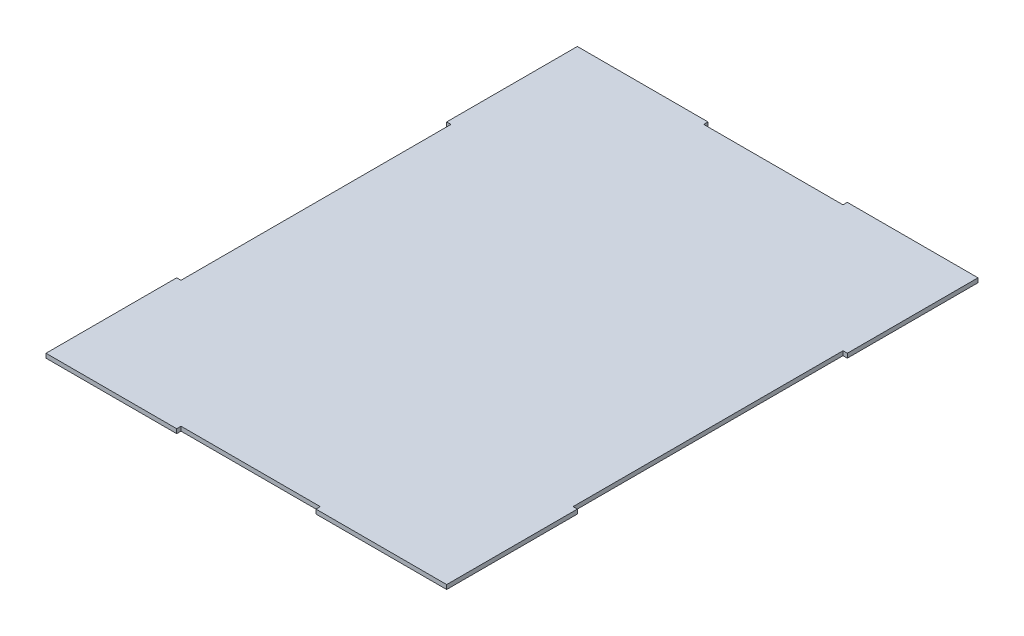
ISO-10303-21;
HEADER;
FILE_DESCRIPTION(('STEP AP214'),'2;1');
FILE_NAME('part.step','',(''),(''),'','','');
FILE_SCHEMA(('AUTOMOTIVE_DESIGN { 1 0 10303 214 1 1 1 1 }'));
ENDSEC;
DATA;
#1=APPLICATION_CONTEXT('core data for automotive mechanical design processes');
#2=APPLICATION_PROTOCOL_DEFINITION('international standard','automotive_design',2000,#1);
#3=PRODUCT_CONTEXT('',#1,'mechanical');
#4=PRODUCT('Part','Part','',(#3));
#5=PRODUCT_RELATED_PRODUCT_CATEGORY('part','',(#4));
#6=PRODUCT_DEFINITION_FORMATION('','',#4);
#7=PRODUCT_DEFINITION_CONTEXT('part definition',#1,'design');
#8=PRODUCT_DEFINITION('design','',#6,#7);
#9=PRODUCT_DEFINITION_SHAPE('','',#8);
#10=(LENGTH_UNIT() NAMED_UNIT(*) SI_UNIT(.MILLI.,.METRE.));
#11=(NAMED_UNIT(*) PLANE_ANGLE_UNIT() SI_UNIT($,.RADIAN.));
#12=(NAMED_UNIT(*) SI_UNIT($,.STERADIAN.) SOLID_ANGLE_UNIT());
#13=UNCERTAINTY_MEASURE_WITH_UNIT(LENGTH_MEASURE(1.E-05),#10,'distance_accuracy_value','');
#14=(GEOMETRIC_REPRESENTATION_CONTEXT(3) GLOBAL_UNCERTAINTY_ASSIGNED_CONTEXT((#13)) GLOBAL_UNIT_ASSIGNED_CONTEXT((#10,
#11,#12)) REPRESENTATION_CONTEXT('',''));
#15=CARTESIAN_POINT('',(0.,0.,0.));
#16=DIRECTION('',(0.,0.,1.));
#17=DIRECTION('',(1.,0.,0.));
#18=AXIS2_PLACEMENT_3D('',#15,#16,#17);
#19=CARTESIAN_POINT('',(0.,3.3,200.));
#20=DIRECTION('',(0.,0.,-1.));
#21=DIRECTION('',(-1.,0.,0.));
#22=AXIS2_PLACEMENT_3D('',#19,#20,#21);
#23=PLANE('',#22);
#24=DIRECTION('',(1.,0.,0.));
#25=VECTOR('',#24,1.);
#26=CARTESIAN_POINT('',(0.,0.,200.));
#27=LINE('',#26,#25);
#28=CARTESIAN_POINT('',(-53.3000000000001,0.,200.));
#29=VERTEX_POINT('',#28);
#30=CARTESIAN_POINT('',(53.3000000000001,0.,200.));
#31=VERTEX_POINT('',#30);
#32=EDGE_CURVE('E217',#29,#31,#27,.T.);
#33=ORIENTED_EDGE('',*,*,#32,.T.);
#34=DIRECTION('',(0.,-1.,0.));
#35=VECTOR('',#34,1.);
#36=CARTESIAN_POINT('',(53.3000000000001,3.3,200.));
#37=LINE('',#36,#35);
#38=CARTESIAN_POINT('',(53.3000000000001,3.3,200.));
#39=VERTEX_POINT('',#38);
#40=EDGE_CURVE('E11',#39,#31,#37,.T.);
#41=ORIENTED_EDGE('',*,*,#40,.F.);
#42=DIRECTION('',(1.,0.,0.));
#43=VECTOR('',#42,1.);
#44=CARTESIAN_POINT('',(0.,3.3,200.));
#45=LINE('',#44,#43);
#46=CARTESIAN_POINT('',(-53.3000000000001,3.3,200.));
#47=VERTEX_POINT('',#46);
#48=EDGE_CURVE('E288',#47,#39,#45,.T.);
#49=ORIENTED_EDGE('',*,*,#48,.F.);
#50=DIRECTION('',(0.,-1.,0.));
#51=VECTOR('',#50,1.);
#52=CARTESIAN_POINT('',(-53.3000000000001,3.3,200.));
#53=LINE('',#52,#51);
#54=EDGE_CURVE('E58',#47,#29,#53,.T.);
#55=ORIENTED_EDGE('',*,*,#54,.T.);
#56=EDGE_LOOP('',(#33,#41,#49,#55));
#57=FACE_BOUND('',#56,.T.);
#58=ADVANCED_FACE('F41',(#57),#23,.F.);
#59=CARTESIAN_POINT('',(53.3000000000114,3.3,3.0259885506409E-12));
#60=DIRECTION('',(1.,0.,0.));
#61=DIRECTION('',(0.,0.,-1.));
#62=AXIS2_PLACEMENT_3D('',#59,#60,#61);
#63=PLANE('',#62);
#64=DIRECTION('',(0.,0.,1.));
#65=VECTOR('',#64,1.);
#66=CARTESIAN_POINT('',(53.3000000000114,0.,3.0259885506409E-12));
#67=LINE('',#66,#65);
#68=CARTESIAN_POINT('',(53.2999999999999,0.,203.3));
#69=VERTEX_POINT('',#68);
#70=EDGE_CURVE('E220',#31,#69,#67,.T.);
#71=ORIENTED_EDGE('',*,*,#70,.T.);
#72=DIRECTION('',(0.,-1.,0.));
#73=VECTOR('',#72,1.);
#74=CARTESIAN_POINT('',(53.2999999999999,3.3,203.3));
#75=LINE('',#74,#73);
#76=CARTESIAN_POINT('',(53.2999999999999,3.3,203.3));
#77=VERTEX_POINT('',#76);
#78=EDGE_CURVE('E50',#77,#69,#75,.T.);
#79=ORIENTED_EDGE('',*,*,#78,.F.);
#80=DIRECTION('',(0.,0.,1.));
#81=VECTOR('',#80,1.);
#82=CARTESIAN_POINT('',(53.3000000000114,3.3,3.0259885506409E-12));
#83=LINE('',#82,#81);
#84=EDGE_CURVE('E133',#39,#77,#83,.T.);
#85=ORIENTED_EDGE('',*,*,#84,.F.);
#86=ORIENTED_EDGE('',*,*,#40,.T.);
#87=EDGE_LOOP('',(#71,#79,#85,#86));
#88=FACE_BOUND('',#87,.T.);
#89=ADVANCED_FACE('F348',(#88),#63,.F.);
#90=CARTESIAN_POINT('',(0.,3.3,203.3));
#91=DIRECTION('',(0.,0.,1.));
#92=DIRECTION('',(1.,0.,0.));
#93=AXIS2_PLACEMENT_3D('',#90,#91,#92);
#94=PLANE('',#93);
#95=DIRECTION('',(-1.,0.,0.));
#96=VECTOR('',#95,1.);
#97=CARTESIAN_POINT('',(0.,0.,203.3));
#98=LINE('',#97,#96);
#99=CARTESIAN_POINT('',(153.3,0.,203.3));
#100=VERTEX_POINT('',#99);
#101=EDGE_CURVE('E224',#100,#69,#98,.T.);
#102=ORIENTED_EDGE('',*,*,#101,.F.);
#103=DIRECTION('',(0.,-1.,0.));
#104=VECTOR('',#103,1.);
#105=CARTESIAN_POINT('',(153.3,3.3,203.3));
#106=LINE('',#105,#104);
#107=CARTESIAN_POINT('',(153.3,3.3,203.3));
#108=VERTEX_POINT('',#107);
#109=EDGE_CURVE('E339',#108,#100,#106,.T.);
#110=ORIENTED_EDGE('',*,*,#109,.F.);
#111=DIRECTION('',(-1.,0.,0.));
#112=VECTOR('',#111,1.);
#113=CARTESIAN_POINT('',(0.,3.3,203.3));
#114=LINE('',#113,#112);
#115=EDGE_CURVE('E347',#108,#77,#114,.T.);
#116=ORIENTED_EDGE('',*,*,#115,.T.);
#117=ORIENTED_EDGE('',*,*,#78,.T.);
#118=EDGE_LOOP('',(#102,#110,#116,#117));
#119=FACE_BOUND('',#118,.T.);
#120=ADVANCED_FACE('F345',(#119),#94,.T.);
#121=CARTESIAN_POINT('',(153.300000000002,3.3,1.28937264905332E-12));
#122=DIRECTION('',(1.,0.,0.));
#123=DIRECTION('',(0.,0.,-1.));
#124=AXIS2_PLACEMENT_3D('',#121,#122,#123);
#125=PLANE('',#124);
#126=DIRECTION('',(0.,0.,1.));
#127=VECTOR('',#126,1.);
#128=CARTESIAN_POINT('',(153.300000000002,0.,1.28937264905332E-12));
#129=LINE('',#128,#127);
#130=CARTESIAN_POINT('',(153.3,0.,103.3));
#131=VERTEX_POINT('',#130);
#132=EDGE_CURVE('E228',#131,#100,#129,.T.);
#133=ORIENTED_EDGE('',*,*,#132,.F.);
#134=DIRECTION('',(0.,-1.,0.));
#135=VECTOR('',#134,1.);
#136=CARTESIAN_POINT('',(153.3,3.3,103.3));
#137=LINE('',#136,#135);
#138=CARTESIAN_POINT('',(153.3,3.3,103.3));
#139=VERTEX_POINT('',#138);
#140=EDGE_CURVE('E336',#139,#131,#137,.T.);
#141=ORIENTED_EDGE('',*,*,#140,.F.);
#142=DIRECTION('',(0.,0.,1.));
#143=VECTOR('',#142,1.);
#144=CARTESIAN_POINT('',(153.300000000002,3.3,1.28937264905332E-12));
#145=LINE('',#144,#143);
#146=EDGE_CURVE('E360',#139,#108,#145,.T.);
#147=ORIENTED_EDGE('',*,*,#146,.T.);
#148=ORIENTED_EDGE('',*,*,#109,.T.);
#149=EDGE_LOOP('',(#133,#141,#147,#148));
#150=FACE_BOUND('',#149,.T.);
#151=ADVANCED_FACE('F356',(#150),#125,.T.);
#152=CARTESIAN_POINT('',(0.,3.3,103.3));
#153=DIRECTION('',(0.,0.,1.));
#154=DIRECTION('',(1.,0.,0.));
#155=AXIS2_PLACEMENT_3D('',#152,#153,#154);
#156=PLANE('',#155);
#157=DIRECTION('',(-1.,0.,0.));
#158=VECTOR('',#157,1.);
#159=CARTESIAN_POINT('',(0.,0.,103.3));
#160=LINE('',#159,#158);
#161=CARTESIAN_POINT('',(150.,0.,103.3));
#162=VERTEX_POINT('',#161);
#163=EDGE_CURVE('E232',#131,#162,#160,.T.);
#164=ORIENTED_EDGE('',*,*,#163,.T.);
#165=DIRECTION('',(0.,-1.,0.));
#166=VECTOR('',#165,1.);
#167=CARTESIAN_POINT('',(150.,3.3,103.3));
#168=LINE('',#167,#166);
#169=CARTESIAN_POINT('',(150.,3.3,103.3));
#170=VERTEX_POINT('',#169);
#171=EDGE_CURVE('E332',#170,#162,#168,.T.);
#172=ORIENTED_EDGE('',*,*,#171,.F.);
#173=DIRECTION('',(-1.,0.,0.));
#174=VECTOR('',#173,1.);
#175=CARTESIAN_POINT('',(0.,3.3,103.3));
#176=LINE('',#175,#174);
#177=EDGE_CURVE('E365',#139,#170,#176,.T.);
#178=ORIENTED_EDGE('',*,*,#177,.F.);
#179=ORIENTED_EDGE('',*,*,#140,.T.);
#180=EDGE_LOOP('',(#164,#172,#178,#179));
#181=FACE_BOUND('',#180,.T.);
#182=ADVANCED_FACE('F437',(#181),#156,.F.);
#183=CARTESIAN_POINT('',(150.,3.3,0.));
#184=DIRECTION('',(-1.,0.,0.));
#185=DIRECTION('',(0.,0.,1.));
#186=AXIS2_PLACEMENT_3D('',#183,#184,#185);
#187=PLANE('',#186);
#188=DIRECTION('',(0.,0.,-1.));
#189=VECTOR('',#188,1.);
#190=CARTESIAN_POINT('',(150.,0.,0.));
#191=LINE('',#190,#189);
#192=CARTESIAN_POINT('',(150.,0.,-103.3));
#193=VERTEX_POINT('',#192);
#194=EDGE_CURVE('E235',#162,#193,#191,.T.);
#195=ORIENTED_EDGE('',*,*,#194,.T.);
#196=DIRECTION('',(0.,-1.,0.));
#197=VECTOR('',#196,1.);
#198=CARTESIAN_POINT('',(150.,3.3,-103.3));
#199=LINE('',#198,#197);
#200=CARTESIAN_POINT('',(150.,3.3,-103.3));
#201=VERTEX_POINT('',#200);
#202=EDGE_CURVE('E328',#201,#193,#199,.T.);
#203=ORIENTED_EDGE('',*,*,#202,.F.);
#204=DIRECTION('',(0.,0.,-1.));
#205=VECTOR('',#204,1.);
#206=CARTESIAN_POINT('',(150.,3.3,0.));
#207=LINE('',#206,#205);
#208=EDGE_CURVE('E372',#170,#201,#207,.T.);
#209=ORIENTED_EDGE('',*,*,#208,.F.);
#210=ORIENTED_EDGE('',*,*,#171,.T.);
#211=EDGE_LOOP('',(#195,#203,#209,#210));
#212=FACE_BOUND('',#211,.T.);
#213=ADVANCED_FACE('F440',(#212),#187,.F.);
#214=CARTESIAN_POINT('',(0.,3.3,-103.3));
#215=DIRECTION('',(0.,0.,-1.));
#216=DIRECTION('',(-1.,0.,0.));
#217=AXIS2_PLACEMENT_3D('',#214,#215,#216);
#218=PLANE('',#217);
#219=DIRECTION('',(1.,0.,0.));
#220=VECTOR('',#219,1.);
#221=CARTESIAN_POINT('',(0.,0.,-103.3));
#222=LINE('',#221,#220);
#223=CARTESIAN_POINT('',(153.3,0.,-103.3));
#224=VERTEX_POINT('',#223);
#225=EDGE_CURVE('E238',#193,#224,#222,.T.);
#226=ORIENTED_EDGE('',*,*,#225,.T.);
#227=DIRECTION('',(0.,-1.,0.));
#228=VECTOR('',#227,1.);
#229=CARTESIAN_POINT('',(153.3,3.3,-103.3));
#230=LINE('',#229,#228);
#231=CARTESIAN_POINT('',(153.3,3.3,-103.3));
#232=VERTEX_POINT('',#231);
#233=EDGE_CURVE('E324',#232,#224,#230,.T.);
#234=ORIENTED_EDGE('',*,*,#233,.F.);
#235=DIRECTION('',(1.,0.,0.));
#236=VECTOR('',#235,1.);
#237=CARTESIAN_POINT('',(0.,3.3,-103.3));
#238=LINE('',#237,#236);
#239=EDGE_CURVE('E375',#201,#232,#238,.T.);
#240=ORIENTED_EDGE('',*,*,#239,.F.);
#241=ORIENTED_EDGE('',*,*,#202,.T.);
#242=EDGE_LOOP('',(#226,#234,#240,#241));
#243=FACE_BOUND('',#242,.T.);
#244=ADVANCED_FACE('F444',(#243),#218,.F.);
#245=CARTESIAN_POINT('',(153.3,3.3,0.));
#246=DIRECTION('',(-1.,0.,0.));
#247=DIRECTION('',(0.,0.,1.));
#248=AXIS2_PLACEMENT_3D('',#245,#246,#247);
#249=PLANE('',#248);
#250=DIRECTION('',(0.,0.,-1.));
#251=VECTOR('',#250,1.);
#252=CARTESIAN_POINT('',(153.3,0.,0.));
#253=LINE('',#252,#251);
#254=CARTESIAN_POINT('',(153.3,0.,-203.3));
#255=VERTEX_POINT('',#254);
#256=EDGE_CURVE('E241',#224,#255,#253,.T.);
#257=ORIENTED_EDGE('',*,*,#256,.T.);
#258=DIRECTION('',(0.,-1.,0.));
#259=VECTOR('',#258,1.);
#260=CARTESIAN_POINT('',(153.3,3.3,-203.3));
#261=LINE('',#260,#259);
#262=CARTESIAN_POINT('',(153.3,3.3,-203.3));
#263=VERTEX_POINT('',#262);
#264=EDGE_CURVE('E320',#263,#255,#261,.T.);
#265=ORIENTED_EDGE('',*,*,#264,.F.);
#266=DIRECTION('',(0.,0.,-1.));
#267=VECTOR('',#266,1.);
#268=CARTESIAN_POINT('',(153.3,3.3,0.));
#269=LINE('',#268,#267);
#270=EDGE_CURVE('E378',#232,#263,#269,.T.);
#271=ORIENTED_EDGE('',*,*,#270,.F.);
#272=ORIENTED_EDGE('',*,*,#233,.T.);
#273=EDGE_LOOP('',(#257,#265,#271,#272));
#274=FACE_BOUND('',#273,.T.);
#275=ADVANCED_FACE('F448',(#274),#249,.F.);
#276=CARTESIAN_POINT('',(0.,3.3,-203.3));
#277=DIRECTION('',(0.,0.,1.));
#278=DIRECTION('',(1.,0.,0.));
#279=AXIS2_PLACEMENT_3D('',#276,#277,#278);
#280=PLANE('',#279);
#281=DIRECTION('',(-1.,0.,0.));
#282=VECTOR('',#281,1.);
#283=CARTESIAN_POINT('',(0.,0.,-203.3));
#284=LINE('',#283,#282);
#285=CARTESIAN_POINT('',(53.2999999999999,0.,-203.3));
#286=VERTEX_POINT('',#285);
#287=EDGE_CURVE('E244',#255,#286,#284,.T.);
#288=ORIENTED_EDGE('',*,*,#287,.T.);
#289=DIRECTION('',(0.,-1.,0.));
#290=VECTOR('',#289,1.);
#291=CARTESIAN_POINT('',(53.2999999999999,3.3,-203.3));
#292=LINE('',#291,#290);
#293=CARTESIAN_POINT('',(53.2999999999999,3.3,-203.3));
#294=VERTEX_POINT('',#293);
#295=EDGE_CURVE('E317',#294,#286,#292,.T.);
#296=ORIENTED_EDGE('',*,*,#295,.F.);
#297=DIRECTION('',(-1.,0.,0.));
#298=VECTOR('',#297,1.);
#299=CARTESIAN_POINT('',(0.,3.3,-203.3));
#300=LINE('',#299,#298);
#301=EDGE_CURVE('E381',#263,#294,#300,.T.);
#302=ORIENTED_EDGE('',*,*,#301,.F.);
#303=ORIENTED_EDGE('',*,*,#264,.T.);
#304=EDGE_LOOP('',(#288,#296,#302,#303));
#305=FACE_BOUND('',#304,.T.);
#306=ADVANCED_FACE('F452',(#305),#280,.F.);
#307=CARTESIAN_POINT('',(53.2999999999999,3.3,0.));
#308=DIRECTION('',(-1.,0.,0.));
#309=DIRECTION('',(0.,0.,1.));
#310=AXIS2_PLACEMENT_3D('',#307,#308,#309);
#311=PLANE('',#310);
#312=DIRECTION('',(0.,0.,-1.));
#313=VECTOR('',#312,1.);
#314=CARTESIAN_POINT('',(53.2999999999999,0.,0.));
#315=LINE('',#314,#313);
#316=CARTESIAN_POINT('',(53.2999999999999,0.,-200.));
#317=VERTEX_POINT('',#316);
#318=EDGE_CURVE('E248',#317,#286,#315,.T.);
#319=ORIENTED_EDGE('',*,*,#318,.F.);
#320=DIRECTION('',(0.,-1.,0.));
#321=VECTOR('',#320,1.);
#322=CARTESIAN_POINT('',(53.2999999999999,3.3,-200.));
#323=LINE('',#322,#321);
#324=CARTESIAN_POINT('',(53.2999999999999,3.3,-200.));
#325=VERTEX_POINT('',#324);
#326=EDGE_CURVE('E314',#325,#317,#323,.T.);
#327=ORIENTED_EDGE('',*,*,#326,.F.);
#328=DIRECTION('',(0.,0.,-1.));
#329=VECTOR('',#328,1.);
#330=CARTESIAN_POINT('',(53.2999999999999,3.3,0.));
#331=LINE('',#330,#329);
#332=EDGE_CURVE('E384',#325,#294,#331,.T.);
#333=ORIENTED_EDGE('',*,*,#332,.T.);
#334=ORIENTED_EDGE('',*,*,#295,.T.);
#335=EDGE_LOOP('',(#319,#327,#333,#334));
#336=FACE_BOUND('',#335,.T.);
#337=ADVANCED_FACE('F456',(#336),#311,.T.);
#338=CARTESIAN_POINT('',(0.,3.3,-200.));
#339=DIRECTION('',(0.,0.,-1.));
#340=DIRECTION('',(-1.,0.,0.));
#341=AXIS2_PLACEMENT_3D('',#338,#339,#340);
#342=PLANE('',#341);
#343=DIRECTION('',(1.,0.,0.));
#344=VECTOR('',#343,1.);
#345=CARTESIAN_POINT('',(0.,0.,-200.));
#346=LINE('',#345,#344);
#347=CARTESIAN_POINT('',(-53.2999999999999,0.,-200.));
#348=VERTEX_POINT('',#347);
#349=EDGE_CURVE('E252',#348,#317,#346,.T.);
#350=ORIENTED_EDGE('',*,*,#349,.F.);
#351=DIRECTION('',(0.,-1.,0.));
#352=VECTOR('',#351,1.);
#353=CARTESIAN_POINT('',(-53.2999999999999,3.3,-200.));
#354=LINE('',#353,#352);
#355=CARTESIAN_POINT('',(-53.2999999999999,3.3,-200.));
#356=VERTEX_POINT('',#355);
#357=EDGE_CURVE('E311',#356,#348,#354,.T.);
#358=ORIENTED_EDGE('',*,*,#357,.F.);
#359=DIRECTION('',(1.,0.,0.));
#360=VECTOR('',#359,1.);
#361=CARTESIAN_POINT('',(0.,3.3,-200.));
#362=LINE('',#361,#360);
#363=EDGE_CURVE('E388',#356,#325,#362,.T.);
#364=ORIENTED_EDGE('',*,*,#363,.T.);
#365=ORIENTED_EDGE('',*,*,#326,.T.);
#366=EDGE_LOOP('',(#350,#358,#364,#365));
#367=FACE_BOUND('',#366,.T.);
#368=ADVANCED_FACE('F460',(#367),#342,.T.);
#369=CARTESIAN_POINT('',(-53.2999999999999,3.3,0.));
#370=DIRECTION('',(-1.,0.,0.));
#371=DIRECTION('',(0.,0.,1.));
#372=AXIS2_PLACEMENT_3D('',#369,#370,#371);
#373=PLANE('',#372);
#374=DIRECTION('',(0.,0.,-1.));
#375=VECTOR('',#374,1.);
#376=CARTESIAN_POINT('',(-53.2999999999999,0.,0.));
#377=LINE('',#376,#375);
#378=CARTESIAN_POINT('',(-53.2999999999999,0.,-203.3));
#379=VERTEX_POINT('',#378);
#380=EDGE_CURVE('E256',#348,#379,#377,.T.);
#381=ORIENTED_EDGE('',*,*,#380,.T.);
#382=DIRECTION('',(0.,-1.,0.));
#383=VECTOR('',#382,1.);
#384=CARTESIAN_POINT('',(-53.2999999999999,3.3,-203.3));
#385=LINE('',#384,#383);
#386=CARTESIAN_POINT('',(-53.2999999999999,3.3,-203.3));
#387=VERTEX_POINT('',#386);
#388=EDGE_CURVE('E308',#387,#379,#385,.T.);
#389=ORIENTED_EDGE('',*,*,#388,.F.);
#390=DIRECTION('',(0.,0.,-1.));
#391=VECTOR('',#390,1.);
#392=CARTESIAN_POINT('',(-53.2999999999999,3.3,0.));
#393=LINE('',#392,#391);
#394=EDGE_CURVE('E392',#356,#387,#393,.T.);
#395=ORIENTED_EDGE('',*,*,#394,.F.);
#396=ORIENTED_EDGE('',*,*,#357,.T.);
#397=EDGE_LOOP('',(#381,#389,#395,#396));
#398=FACE_BOUND('',#397,.T.);
#399=ADVANCED_FACE('F464',(#398),#373,.F.);
#400=CARTESIAN_POINT('',(0.,3.3,-203.3));
#401=DIRECTION('',(0.,0.,-1.));
#402=DIRECTION('',(-1.,0.,0.));
#403=AXIS2_PLACEMENT_3D('',#400,#401,#402);
#404=PLANE('',#403);
#405=DIRECTION('',(1.,0.,0.));
#406=VECTOR('',#405,1.);
#407=CARTESIAN_POINT('',(0.,0.,-203.3));
#408=LINE('',#407,#406);
#409=CARTESIAN_POINT('',(-153.3,0.,-203.3));
#410=VERTEX_POINT('',#409);
#411=EDGE_CURVE('E260',#410,#379,#408,.T.);
#412=ORIENTED_EDGE('',*,*,#411,.F.);
#413=DIRECTION('',(0.,-1.,0.));
#414=VECTOR('',#413,1.);
#415=CARTESIAN_POINT('',(-153.3,3.3,-203.3));
#416=LINE('',#415,#414);
#417=CARTESIAN_POINT('',(-153.3,3.3,-203.3));
#418=VERTEX_POINT('',#417);
#419=EDGE_CURVE('E305',#418,#410,#416,.T.);
#420=ORIENTED_EDGE('',*,*,#419,.F.);
#421=DIRECTION('',(1.,0.,0.));
#422=VECTOR('',#421,1.);
#423=CARTESIAN_POINT('',(0.,3.3,-203.3));
#424=LINE('',#423,#422);
#425=EDGE_CURVE('E395',#418,#387,#424,.T.);
#426=ORIENTED_EDGE('',*,*,#425,.T.);
#427=ORIENTED_EDGE('',*,*,#388,.T.);
#428=EDGE_LOOP('',(#412,#420,#426,#427));
#429=FACE_BOUND('',#428,.T.);
#430=ADVANCED_FACE('F468',(#429),#404,.T.);
#431=CARTESIAN_POINT('',(-153.3,3.3,1.27647892256277E-13));
#432=DIRECTION('',(1.,0.,0.));
#433=DIRECTION('',(0.,0.,-1.));
#434=AXIS2_PLACEMENT_3D('',#431,#432,#433);
#435=PLANE('',#434);
#436=DIRECTION('',(0.,0.,1.));
#437=VECTOR('',#436,1.);
#438=CARTESIAN_POINT('',(-153.3,0.,1.27647892256277E-13));
#439=LINE('',#438,#437);
#440=CARTESIAN_POINT('',(-153.3,0.,-103.3));
#441=VERTEX_POINT('',#440);
#442=EDGE_CURVE('E264',#410,#441,#439,.T.);
#443=ORIENTED_EDGE('',*,*,#442,.T.);
#444=DIRECTION('',(0.,-1.,0.));
#445=VECTOR('',#444,1.);
#446=CARTESIAN_POINT('',(-153.3,3.3,-103.3));
#447=LINE('',#446,#445);
#448=CARTESIAN_POINT('',(-153.3,3.3,-103.3));
#449=VERTEX_POINT('',#448);
#450=EDGE_CURVE('E302',#449,#441,#447,.T.);
#451=ORIENTED_EDGE('',*,*,#450,.F.);
#452=DIRECTION('',(0.,0.,1.));
#453=VECTOR('',#452,1.);
#454=CARTESIAN_POINT('',(-153.3,3.3,1.27647892256277E-13));
#455=LINE('',#454,#453);
#456=EDGE_CURVE('E399',#418,#449,#455,.T.);
#457=ORIENTED_EDGE('',*,*,#456,.F.);
#458=ORIENTED_EDGE('',*,*,#419,.T.);
#459=EDGE_LOOP('',(#443,#451,#457,#458));
#460=FACE_BOUND('',#459,.T.);
#461=ADVANCED_FACE('F472',(#460),#435,.F.);
#462=CARTESIAN_POINT('',(0.,3.3,-103.3));
#463=DIRECTION('',(0.,0.,1.));
#464=DIRECTION('',(1.,0.,0.));
#465=AXIS2_PLACEMENT_3D('',#462,#463,#464);
#466=PLANE('',#465);
#467=DIRECTION('',(-1.,0.,0.));
#468=VECTOR('',#467,1.);
#469=CARTESIAN_POINT('',(0.,0.,-103.3));
#470=LINE('',#469,#468);
#471=CARTESIAN_POINT('',(-150.,0.,-103.3));
#472=VERTEX_POINT('',#471);
#473=EDGE_CURVE('E268',#472,#441,#470,.T.);
#474=ORIENTED_EDGE('',*,*,#473,.F.);
#475=DIRECTION('',(0.,-1.,0.));
#476=VECTOR('',#475,1.);
#477=CARTESIAN_POINT('',(-150.,3.3,-103.3));
#478=LINE('',#477,#476);
#479=CARTESIAN_POINT('',(-150.,3.3,-103.3));
#480=VERTEX_POINT('',#479);
#481=EDGE_CURVE('E299',#480,#472,#478,.T.);
#482=ORIENTED_EDGE('',*,*,#481,.F.);
#483=DIRECTION('',(-1.,0.,0.));
#484=VECTOR('',#483,1.);
#485=CARTESIAN_POINT('',(0.,3.3,-103.3));
#486=LINE('',#485,#484);
#487=EDGE_CURVE('E402',#480,#449,#486,.T.);
#488=ORIENTED_EDGE('',*,*,#487,.T.);
#489=ORIENTED_EDGE('',*,*,#450,.T.);
#490=EDGE_LOOP('',(#474,#482,#488,#489));
#491=FACE_BOUND('',#490,.T.);
#492=ADVANCED_FACE('F476',(#491),#466,.T.);
#493=CARTESIAN_POINT('',(-150.,3.3,0.));
#494=DIRECTION('',(1.,0.,0.));
#495=DIRECTION('',(0.,0.,-1.));
#496=AXIS2_PLACEMENT_3D('',#493,#494,#495);
#497=PLANE('',#496);
#498=DIRECTION('',(0.,0.,1.));
#499=VECTOR('',#498,1.);
#500=CARTESIAN_POINT('',(-150.,0.,0.));
#501=LINE('',#500,#499);
#502=CARTESIAN_POINT('',(-150.,0.,103.3));
#503=VERTEX_POINT('',#502);
#504=EDGE_CURVE('E272',#472,#503,#501,.T.);
#505=ORIENTED_EDGE('',*,*,#504,.T.);
#506=DIRECTION('',(0.,-1.,0.));
#507=VECTOR('',#506,1.);
#508=CARTESIAN_POINT('',(-150.,3.3,103.3));
#509=LINE('',#508,#507);
#510=CARTESIAN_POINT('',(-150.,3.3,103.3));
#511=VERTEX_POINT('',#510);
#512=EDGE_CURVE('E295',#511,#503,#509,.T.);
#513=ORIENTED_EDGE('',*,*,#512,.F.);
#514=DIRECTION('',(0.,0.,1.));
#515=VECTOR('',#514,1.);
#516=CARTESIAN_POINT('',(-150.,3.3,0.));
#517=LINE('',#516,#515);
#518=EDGE_CURVE('E211',#480,#511,#517,.T.);
#519=ORIENTED_EDGE('',*,*,#518,.F.);
#520=ORIENTED_EDGE('',*,*,#481,.T.);
#521=EDGE_LOOP('',(#505,#513,#519,#520));
#522=FACE_BOUND('',#521,.T.);
#523=ADVANCED_FACE('F410',(#522),#497,.F.);
#524=CARTESIAN_POINT('',(0.,3.3,103.3));
#525=DIRECTION('',(0.,0.,1.));
#526=DIRECTION('',(1.,0.,0.));
#527=AXIS2_PLACEMENT_3D('',#524,#525,#526);
#528=PLANE('',#527);
#529=DIRECTION('',(-1.,0.,0.));
#530=VECTOR('',#529,1.);
#531=CARTESIAN_POINT('',(0.,0.,103.3));
#532=LINE('',#531,#530);
#533=CARTESIAN_POINT('',(-153.3,0.,103.3));
#534=VERTEX_POINT('',#533);
#535=EDGE_CURVE('E275',#503,#534,#532,.T.);
#536=ORIENTED_EDGE('',*,*,#535,.T.);
#537=DIRECTION('',(0.,-1.,0.));
#538=VECTOR('',#537,1.);
#539=CARTESIAN_POINT('',(-153.3,3.3,103.3));
#540=LINE('',#539,#538);
#541=CARTESIAN_POINT('',(-153.3,3.3,103.3));
#542=VERTEX_POINT('',#541);
#543=EDGE_CURVE('E195',#542,#534,#540,.T.);
#544=ORIENTED_EDGE('',*,*,#543,.F.);
#545=DIRECTION('',(-1.,0.,0.));
#546=VECTOR('',#545,1.);
#547=CARTESIAN_POINT('',(0.,3.3,103.3));
#548=LINE('',#547,#546);
#549=EDGE_CURVE('E206',#511,#542,#548,.T.);
#550=ORIENTED_EDGE('',*,*,#549,.F.);
#551=ORIENTED_EDGE('',*,*,#512,.T.);
#552=EDGE_LOOP('',(#536,#544,#550,#551));
#553=FACE_BOUND('',#552,.T.);
#554=ADVANCED_FACE('F414',(#553),#528,.F.);
#555=CARTESIAN_POINT('',(-153.3,3.3,0.));
#556=DIRECTION('',(-1.,0.,0.));
#557=DIRECTION('',(0.,0.,1.));
#558=AXIS2_PLACEMENT_3D('',#555,#556,#557);
#559=PLANE('',#558);
#560=DIRECTION('',(0.,0.,-1.));
#561=VECTOR('',#560,1.);
#562=CARTESIAN_POINT('',(-153.3,0.,0.));
#563=LINE('',#562,#561);
#564=CARTESIAN_POINT('',(-153.3,0.,203.3));
#565=VERTEX_POINT('',#564);
#566=EDGE_CURVE('E191',#565,#534,#563,.T.);
#567=ORIENTED_EDGE('',*,*,#566,.F.);
#568=DIRECTION('',(0.,-1.,0.));
#569=VECTOR('',#568,1.);
#570=CARTESIAN_POINT('',(-153.3,3.3,203.3));
#571=LINE('',#570,#569);
#572=CARTESIAN_POINT('',(-153.3,3.3,203.3));
#573=VERTEX_POINT('',#572);
#574=EDGE_CURVE('E185',#573,#565,#571,.T.);
#575=ORIENTED_EDGE('',*,*,#574,.F.);
#576=DIRECTION('',(0.,0.,-1.));
#577=VECTOR('',#576,1.);
#578=CARTESIAN_POINT('',(-153.3,3.3,0.));
#579=LINE('',#578,#577);
#580=EDGE_CURVE('E189',#573,#542,#579,.T.);
#581=ORIENTED_EDGE('',*,*,#580,.T.);
#582=ORIENTED_EDGE('',*,*,#543,.T.);
#583=EDGE_LOOP('',(#567,#575,#581,#582));
#584=FACE_BOUND('',#583,.T.);
#585=ADVANCED_FACE('F187',(#584),#559,.T.);
#586=CARTESIAN_POINT('',(0.,3.3,203.3));
#587=DIRECTION('',(0.,0.,-1.));
#588=DIRECTION('',(-1.,0.,0.));
#589=AXIS2_PLACEMENT_3D('',#586,#587,#588);
#590=PLANE('',#589);
#591=DIRECTION('',(1.,0.,0.));
#592=VECTOR('',#591,1.);
#593=CARTESIAN_POINT('',(0.,0.,203.3));
#594=LINE('',#593,#592);
#595=CARTESIAN_POINT('',(-53.2999999999999,0.,203.3));
#596=VERTEX_POINT('',#595);
#597=EDGE_CURVE('E281',#565,#596,#594,.T.);
#598=ORIENTED_EDGE('',*,*,#597,.T.);
#599=DIRECTION('',(0.,-1.,0.));
#600=VECTOR('',#599,1.);
#601=CARTESIAN_POINT('',(-53.2999999999999,3.3,203.3));
#602=LINE('',#601,#600);
#603=CARTESIAN_POINT('',(-53.2999999999999,3.3,203.3));
#604=VERTEX_POINT('',#603);
#605=EDGE_CURVE('E121',#604,#596,#602,.T.);
#606=ORIENTED_EDGE('',*,*,#605,.F.);
#607=DIRECTION('',(1.,0.,0.));
#608=VECTOR('',#607,1.);
#609=CARTESIAN_POINT('',(0.,3.3,203.3));
#610=LINE('',#609,#608);
#611=EDGE_CURVE('E197',#573,#604,#610,.T.);
#612=ORIENTED_EDGE('',*,*,#611,.F.);
#613=ORIENTED_EDGE('',*,*,#574,.T.);
#614=EDGE_LOOP('',(#598,#606,#612,#613));
#615=FACE_BOUND('',#614,.T.);
#616=ADVANCED_FACE('F198',(#615),#590,.F.);
#617=CARTESIAN_POINT('',(-53.3000000000114,3.3,3.0259885506409E-12));
#618=DIRECTION('',(1.,0.,0.));
#619=DIRECTION('',(0.,0.,-1.));
#620=AXIS2_PLACEMENT_3D('',#617,#618,#619);
#621=PLANE('',#620);
#622=DIRECTION('',(0.,0.,1.));
#623=VECTOR('',#622,1.);
#624=CARTESIAN_POINT('',(-53.3000000000114,0.,3.0259885506409E-12));
#625=LINE('',#624,#623);
#626=EDGE_CURVE('E284',#29,#596,#625,.T.);
#627=ORIENTED_EDGE('',*,*,#626,.F.);
#628=ORIENTED_EDGE('',*,*,#54,.F.);
#629=DIRECTION('',(0.,0.,1.));
#630=VECTOR('',#629,1.);
#631=CARTESIAN_POINT('',(-53.3000000000114,3.3,3.0259885506409E-12));
#632=LINE('',#631,#630);
#633=EDGE_CURVE('E202',#47,#604,#632,.T.);
#634=ORIENTED_EDGE('',*,*,#633,.T.);
#635=ORIENTED_EDGE('',*,*,#605,.T.);
#636=EDGE_LOOP('',(#627,#628,#634,#635));
#637=FACE_BOUND('',#636,.T.);
#638=ADVANCED_FACE('F415',(#637),#621,.T.);
#639=CARTESIAN_POINT('',(0.,3.3,0.));
#640=DIRECTION('',(0.,1.,0.));
#641=DIRECTION('',(0.,0.,1.));
#642=AXIS2_PLACEMENT_3D('',#639,#640,#641);
#643=PLANE('',#642);
#644=ORIENTED_EDGE('',*,*,#48,.T.);
#645=ORIENTED_EDGE('',*,*,#84,.T.);
#646=ORIENTED_EDGE('',*,*,#115,.F.);
#647=ORIENTED_EDGE('',*,*,#146,.F.);
#648=ORIENTED_EDGE('',*,*,#177,.T.);
#649=ORIENTED_EDGE('',*,*,#208,.T.);
#650=ORIENTED_EDGE('',*,*,#239,.T.);
#651=ORIENTED_EDGE('',*,*,#270,.T.);
#652=ORIENTED_EDGE('',*,*,#301,.T.);
#653=ORIENTED_EDGE('',*,*,#332,.F.);
#654=ORIENTED_EDGE('',*,*,#363,.F.);
#655=ORIENTED_EDGE('',*,*,#394,.T.);
#656=ORIENTED_EDGE('',*,*,#425,.F.);
#657=ORIENTED_EDGE('',*,*,#456,.T.);
#658=ORIENTED_EDGE('',*,*,#487,.F.);
#659=ORIENTED_EDGE('',*,*,#518,.T.);
#660=ORIENTED_EDGE('',*,*,#549,.T.);
#661=ORIENTED_EDGE('',*,*,#580,.F.);
#662=ORIENTED_EDGE('',*,*,#611,.T.);
#663=ORIENTED_EDGE('',*,*,#633,.F.);
#664=EDGE_LOOP('',(#644,#645,#646,#647,#648,#649,#650,#651,#652,#653,#654,#655,#656,#657,#658,
#659,#660,#661,#662,#663));
#665=FACE_BOUND('',#664,.T.);
#666=ADVANCED_FACE('F204',(#665),#643,.T.);
#667=CARTESIAN_POINT('',(0.,0.,0.));
#668=DIRECTION('',(0.,1.,0.));
#669=DIRECTION('',(0.,0.,1.));
#670=AXIS2_PLACEMENT_3D('',#667,#668,#669);
#671=PLANE('',#670);
#672=ORIENTED_EDGE('',*,*,#32,.F.);
#673=ORIENTED_EDGE('',*,*,#626,.T.);
#674=ORIENTED_EDGE('',*,*,#597,.F.);
#675=ORIENTED_EDGE('',*,*,#566,.T.);
#676=ORIENTED_EDGE('',*,*,#535,.F.);
#677=ORIENTED_EDGE('',*,*,#504,.F.);
#678=ORIENTED_EDGE('',*,*,#473,.T.);
#679=ORIENTED_EDGE('',*,*,#442,.F.);
#680=ORIENTED_EDGE('',*,*,#411,.T.);
#681=ORIENTED_EDGE('',*,*,#380,.F.);
#682=ORIENTED_EDGE('',*,*,#349,.T.);
#683=ORIENTED_EDGE('',*,*,#318,.T.);
#684=ORIENTED_EDGE('',*,*,#287,.F.);
#685=ORIENTED_EDGE('',*,*,#256,.F.);
#686=ORIENTED_EDGE('',*,*,#225,.F.);
#687=ORIENTED_EDGE('',*,*,#194,.F.);
#688=ORIENTED_EDGE('',*,*,#163,.F.);
#689=ORIENTED_EDGE('',*,*,#132,.T.);
#690=ORIENTED_EDGE('',*,*,#101,.T.);
#691=ORIENTED_EDGE('',*,*,#70,.F.);
#692=EDGE_LOOP('',(#672,#673,#674,#675,#676,#677,#678,#679,#680,#681,#682,#683,#684,#685,#686,
#687,#688,#689,#690,#691));
#693=FACE_BOUND('',#692,.T.);
#694=ADVANCED_FACE('F351',(#693),#671,.F.);
#695=CLOSED_SHELL('',(#58,#89,#120,#151,#182,#213,#244,#275,#306,#337,#368,#399,#430,#461,#492,
#523,#554,#585,#616,#638,#666,#694));
#696=MANIFOLD_SOLID_BREP('B2',#695);
#697=ADVANCED_BREP_SHAPE_REPRESENTATION('',(#18,#696),#14);
#698=SHAPE_DEFINITION_REPRESENTATION(#9,#697);
ENDSEC;
END-ISO-10303-21;
